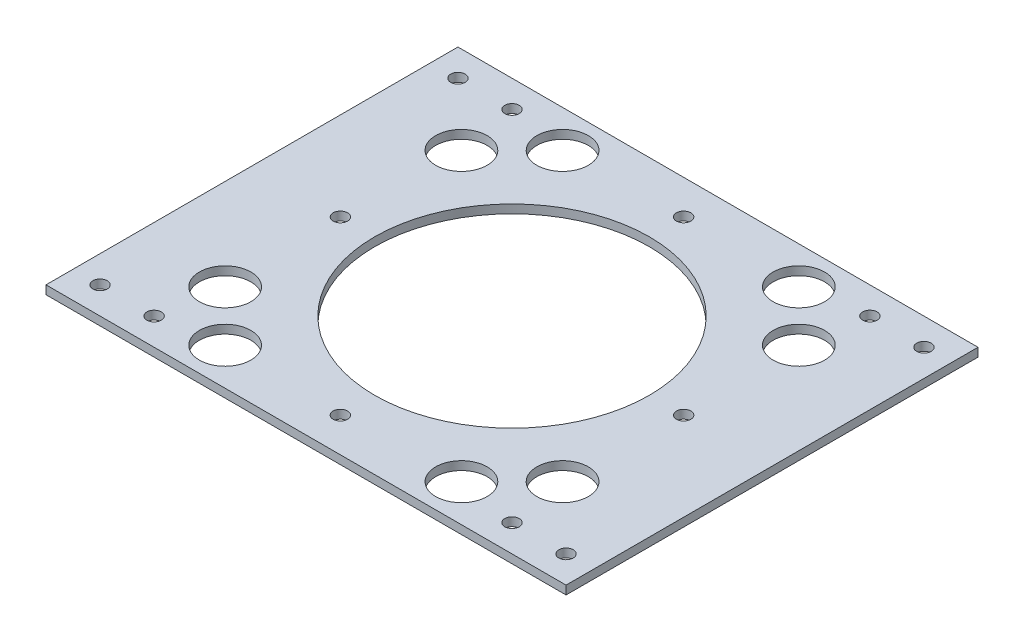
ISO-10303-21;
HEADER;
FILE_DESCRIPTION(('STEP AP214'),'2;1');
FILE_NAME('part.step','',(''),(''),'','','');
FILE_SCHEMA(('AUTOMOTIVE_DESIGN { 1 0 10303 214 1 1 1 1 }'));
ENDSEC;
DATA;
#1=APPLICATION_CONTEXT('core data for automotive mechanical design processes');
#2=APPLICATION_PROTOCOL_DEFINITION('international standard','automotive_design',2000,#1);
#3=PRODUCT_CONTEXT('',#1,'mechanical');
#4=PRODUCT('Part','Part','',(#3));
#5=PRODUCT_RELATED_PRODUCT_CATEGORY('part','',(#4));
#6=PRODUCT_DEFINITION_FORMATION('','',#4);
#7=PRODUCT_DEFINITION_CONTEXT('part definition',#1,'design');
#8=PRODUCT_DEFINITION('design','',#6,#7);
#9=PRODUCT_DEFINITION_SHAPE('','',#8);
#10=(LENGTH_UNIT() NAMED_UNIT(*) SI_UNIT(.MILLI.,.METRE.));
#11=(NAMED_UNIT(*) PLANE_ANGLE_UNIT() SI_UNIT($,.RADIAN.));
#12=(NAMED_UNIT(*) SI_UNIT($,.STERADIAN.) SOLID_ANGLE_UNIT());
#13=UNCERTAINTY_MEASURE_WITH_UNIT(LENGTH_MEASURE(1.E-05),#10,'distance_accuracy_value','');
#14=(GEOMETRIC_REPRESENTATION_CONTEXT(3) GLOBAL_UNCERTAINTY_ASSIGNED_CONTEXT((#13)) GLOBAL_UNIT_ASSIGNED_CONTEXT((#10,
#11,#12)) REPRESENTATION_CONTEXT('',''));
#15=CARTESIAN_POINT('',(0.,0.,0.));
#16=DIRECTION('',(0.,0.,1.));
#17=DIRECTION('',(1.,0.,0.));
#18=AXIS2_PLACEMENT_3D('',#15,#16,#17);
#19=CARTESIAN_POINT('',(0.,3.175,0.));
#20=DIRECTION('',(0.,-1.,0.));
#21=DIRECTION('',(0.,0.,-1.));
#22=AXIS2_PLACEMENT_3D('',#19,#20,#21);
#23=PLANE('',#22);
#24=CARTESIAN_POINT('',(-86.2,3.175,66.2));
#25=DIRECTION('',(0.,-1.,0.));
#26=DIRECTION('',(0.,0.,1.));
#27=AXIS2_PLACEMENT_3D('',#24,#25,#26);
#28=CIRCLE('',#27,2.665000004);
#29=CARTESIAN_POINT('',(-86.2,3.175,68.865000004));
#30=VERTEX_POINT('',#29);
#31=EDGE_CURVE('E398',#30,#30,#28,.T.);
#32=ORIENTED_EDGE('',*,*,#31,.T.);
#33=EDGE_LOOP('',(#32));
#34=FACE_BOUND('',#33,.T.);
#35=CARTESIAN_POINT('',(-86.2,3.175,-66.2));
#36=DIRECTION('',(0.,-1.,0.));
#37=DIRECTION('',(0.,0.,1.));
#38=AXIS2_PLACEMENT_3D('',#35,#36,#37);
#39=CIRCLE('',#38,2.665000004);
#40=CARTESIAN_POINT('',(-86.2,3.175,-63.534999996));
#41=VERTEX_POINT('',#40);
#42=EDGE_CURVE('E406',#41,#41,#39,.T.);
#43=ORIENTED_EDGE('',*,*,#42,.T.);
#44=EDGE_LOOP('',(#43));
#45=FACE_BOUND('',#44,.T.);
#46=CARTESIAN_POINT('',(86.2,3.175,66.2));
#47=DIRECTION('',(0.,1.,0.));
#48=DIRECTION('',(0.,0.,1.));
#49=AXIS2_PLACEMENT_3D('',#46,#47,#48);
#50=CIRCLE('',#49,2.665000004);
#51=CARTESIAN_POINT('',(86.2,3.175,68.865000004));
#52=VERTEX_POINT('',#51);
#53=EDGE_CURVE('E119',#52,#52,#50,.T.);
#54=ORIENTED_EDGE('',*,*,#53,.F.);
#55=EDGE_LOOP('',(#54));
#56=FACE_BOUND('',#55,.T.);
#57=CARTESIAN_POINT('',(86.2,3.175,-66.2));
#58=DIRECTION('',(0.,1.,0.));
#59=DIRECTION('',(0.,0.,1.));
#60=AXIS2_PLACEMENT_3D('',#57,#58,#59);
#61=CIRCLE('',#60,2.665000004);
#62=CARTESIAN_POINT('',(86.2,3.175,-63.534999996));
#63=VERTEX_POINT('',#62);
#64=EDGE_CURVE('E127',#63,#63,#61,.T.);
#65=ORIENTED_EDGE('',*,*,#64,.F.);
#66=EDGE_LOOP('',(#65));
#67=FACE_BOUND('',#66,.T.);
#68=CARTESIAN_POINT('',(0.,3.175,63.5));
#69=DIRECTION('',(0.,1.,0.));
#70=DIRECTION('',(0.,0.,1.));
#71=AXIS2_PLACEMENT_3D('',#68,#69,#70);
#72=CIRCLE('',#71,2.665000004);
#73=CARTESIAN_POINT('',(0.,3.175,66.165000004));
#74=VERTEX_POINT('',#73);
#75=EDGE_CURVE('E147',#74,#74,#72,.T.);
#76=ORIENTED_EDGE('',*,*,#75,.F.);
#77=EDGE_LOOP('',(#76));
#78=FACE_BOUND('',#77,.T.);
#79=CARTESIAN_POINT('',(-63.5,3.175,-2.13932557841953E-13));
#80=DIRECTION('',(0.,1.,0.));
#81=DIRECTION('',(0.,0.,1.));
#82=AXIS2_PLACEMENT_3D('',#79,#80,#81);
#83=CIRCLE('',#82,2.665000004);
#84=CARTESIAN_POINT('',(-63.5,3.175,2.66500000399978));
#85=VERTEX_POINT('',#84);
#86=EDGE_CURVE('E156',#85,#85,#83,.T.);
#87=ORIENTED_EDGE('',*,*,#86,.F.);
#88=EDGE_LOOP('',(#87));
#89=FACE_BOUND('',#88,.T.);
#90=CARTESIAN_POINT('',(4.35641622858492E-13,3.175,-63.5));
#91=DIRECTION('',(0.,1.,0.));
#92=DIRECTION('',(0.,0.,1.));
#93=AXIS2_PLACEMENT_3D('',#90,#91,#92);
#94=CIRCLE('',#93,2.665000004);
#95=CARTESIAN_POINT('',(4.35641622858492E-13,3.175,-60.834999996));
#96=VERTEX_POINT('',#95);
#97=EDGE_CURVE('E164',#96,#96,#94,.T.);
#98=ORIENTED_EDGE('',*,*,#97,.F.);
#99=EDGE_LOOP('',(#98));
#100=FACE_BOUND('',#99,.T.);
#101=CARTESIAN_POINT('',(63.5,3.175,6.57350687875031E-13));
#102=DIRECTION('',(0.,1.,0.));
#103=DIRECTION('',(0.,0.,1.));
#104=AXIS2_PLACEMENT_3D('',#101,#102,#103);
#105=CIRCLE('',#104,2.665000004);
#106=CARTESIAN_POINT('',(63.5,3.175,2.66500000400065));
#107=VERTEX_POINT('',#106);
#108=EDGE_CURVE('E172',#107,#107,#105,.T.);
#109=ORIENTED_EDGE('',*,*,#108,.F.);
#110=EDGE_LOOP('',(#109));
#111=FACE_BOUND('',#110,.T.);
#112=CARTESIAN_POINT('',(-43.7065244499497,3.175,-62.4193857748211));
#113=DIRECTION('',(0.,1.,0.));
#114=DIRECTION('',(0.,0.,1.));
#115=AXIS2_PLACEMENT_3D('',#112,#113,#114);
#116=CIRCLE('',#115,9.525);
#117=CARTESIAN_POINT('',(-43.7065244499497,3.175,-52.8943857748211));
#118=VERTEX_POINT('',#117);
#119=EDGE_CURVE('E210',#118,#118,#116,.T.);
#120=ORIENTED_EDGE('',*,*,#119,.F.);
#121=EDGE_LOOP('',(#120));
#122=FACE_BOUND('',#121,.T.);
#123=CARTESIAN_POINT('',(62.4193857748212,3.175,-43.7065244499496));
#124=DIRECTION('',(0.,1.,0.));
#125=DIRECTION('',(0.,0.,-1.));
#126=AXIS2_PLACEMENT_3D('',#123,#124,#125);
#127=CIRCLE('',#126,9.52500000000001);
#128=CARTESIAN_POINT('',(62.4193857748212,3.175,-53.2315244499496));
#129=VERTEX_POINT('',#128);
#130=EDGE_CURVE('E201',#129,#129,#127,.T.);
#131=ORIENTED_EDGE('',*,*,#130,.F.);
#132=EDGE_LOOP('',(#131));
#133=FACE_BOUND('',#132,.T.);
#134=CARTESIAN_POINT('',(43.7065244499497,3.175,-62.4193857748211));
#135=DIRECTION('',(0.,1.,0.));
#136=DIRECTION('',(0.,0.,-1.));
#137=AXIS2_PLACEMENT_3D('',#134,#135,#136);
#138=CIRCLE('',#137,9.525);
#139=CARTESIAN_POINT('',(43.7065244499497,3.175,-71.9443857748211));
#140=VERTEX_POINT('',#139);
#141=EDGE_CURVE('E226',#140,#140,#138,.T.);
#142=ORIENTED_EDGE('',*,*,#141,.F.);
#143=EDGE_LOOP('',(#142));
#144=FACE_BOUND('',#143,.T.);
#145=CARTESIAN_POINT('',(62.4193857748212,3.175,43.7065244499496));
#146=DIRECTION('',(0.,1.,0.));
#147=DIRECTION('',(0.,0.,1.));
#148=AXIS2_PLACEMENT_3D('',#145,#146,#147);
#149=CIRCLE('',#148,9.52500000000001);
#150=CARTESIAN_POINT('',(62.4193857748212,3.175,53.2315244499496));
#151=VERTEX_POINT('',#150);
#152=EDGE_CURVE('E217',#151,#151,#149,.T.);
#153=ORIENTED_EDGE('',*,*,#152,.F.);
#154=EDGE_LOOP('',(#153));
#155=FACE_BOUND('',#154,.T.);
#156=CARTESIAN_POINT('',(-62.4193857748213,3.175,43.7065244499496));
#157=DIRECTION('',(0.,1.,0.));
#158=DIRECTION('',(0.,0.,-1.));
#159=AXIS2_PLACEMENT_3D('',#156,#157,#158);
#160=CIRCLE('',#159,9.525);
#161=CARTESIAN_POINT('',(-62.4193857748213,3.175,34.1815244499496));
#162=VERTEX_POINT('',#161);
#163=EDGE_CURVE('E179',#162,#162,#160,.T.);
#164=ORIENTED_EDGE('',*,*,#163,.F.);
#165=EDGE_LOOP('',(#164));
#166=FACE_BOUND('',#165,.T.);
#167=CARTESIAN_POINT('',(-43.7065244499497,3.175,62.4193857748211));
#168=DIRECTION('',(0.,1.,0.));
#169=DIRECTION('',(0.,0.,-1.));
#170=AXIS2_PLACEMENT_3D('',#167,#168,#169);
#171=CIRCLE('',#170,9.525);
#172=CARTESIAN_POINT('',(-43.7065244499497,3.175,52.8943857748211));
#173=VERTEX_POINT('',#172);
#174=EDGE_CURVE('E194',#173,#173,#171,.T.);
#175=ORIENTED_EDGE('',*,*,#174,.F.);
#176=EDGE_LOOP('',(#175));
#177=FACE_BOUND('',#176,.T.);
#178=CARTESIAN_POINT('',(-62.4193857748212,3.175,-43.7065244499496));
#179=DIRECTION('',(0.,1.,0.));
#180=DIRECTION('',(0.,0.,1.));
#181=AXIS2_PLACEMENT_3D('',#178,#179,#180);
#182=CIRCLE('',#181,9.525);
#183=CARTESIAN_POINT('',(-62.4193857748212,3.175,-34.1815244499496));
#184=VERTEX_POINT('',#183);
#185=EDGE_CURVE('E186',#184,#184,#182,.T.);
#186=ORIENTED_EDGE('',*,*,#185,.F.);
#187=EDGE_LOOP('',(#186));
#188=FACE_BOUND('',#187,.T.);
#189=CARTESIAN_POINT('',(43.7065244499497,3.175,62.4193857748212));
#190=DIRECTION('',(0.,1.,0.));
#191=DIRECTION('',(0.,0.,1.));
#192=AXIS2_PLACEMENT_3D('',#189,#190,#191);
#193=CIRCLE('',#192,9.525);
#194=CARTESIAN_POINT('',(43.7065244499497,3.175,71.9443857748212));
#195=VERTEX_POINT('',#194);
#196=EDGE_CURVE('E233',#195,#195,#193,.T.);
#197=ORIENTED_EDGE('',*,*,#196,.F.);
#198=EDGE_LOOP('',(#197));
#199=FACE_BOUND('',#198,.T.);
#200=CARTESIAN_POINT('',(66.2,3.175,66.2));
#201=DIRECTION('',(0.,1.,0.));
#202=DIRECTION('',(0.,0.,-1.));
#203=AXIS2_PLACEMENT_3D('',#200,#201,#202);
#204=CIRCLE('',#203,2.665000004);
#205=CARTESIAN_POINT('',(66.2,3.175,63.534999996));
#206=VERTEX_POINT('',#205);
#207=EDGE_CURVE('E258',#206,#206,#204,.T.);
#208=ORIENTED_EDGE('',*,*,#207,.F.);
#209=EDGE_LOOP('',(#208));
#210=FACE_BOUND('',#209,.T.);
#211=CARTESIAN_POINT('',(66.2,3.175,-66.2));
#212=DIRECTION('',(0.,1.,0.));
#213=DIRECTION('',(0.,0.,1.));
#214=AXIS2_PLACEMENT_3D('',#211,#212,#213);
#215=CIRCLE('',#214,2.665000004);
#216=CARTESIAN_POINT('',(66.2,3.175,-63.534999996));
#217=VERTEX_POINT('',#216);
#218=EDGE_CURVE('E250',#217,#217,#215,.T.);
#219=ORIENTED_EDGE('',*,*,#218,.F.);
#220=EDGE_LOOP('',(#219));
#221=FACE_BOUND('',#220,.T.);
#222=CARTESIAN_POINT('',(-66.2,3.175,-66.2));
#223=DIRECTION('',(0.,1.,0.));
#224=DIRECTION('',(0.,0.,-1.));
#225=AXIS2_PLACEMENT_3D('',#222,#223,#224);
#226=CIRCLE('',#225,2.665000004);
#227=CARTESIAN_POINT('',(-66.2,3.175,-68.865000004));
#228=VERTEX_POINT('',#227);
#229=EDGE_CURVE('E241',#228,#228,#226,.T.);
#230=ORIENTED_EDGE('',*,*,#229,.F.);
#231=EDGE_LOOP('',(#230));
#232=FACE_BOUND('',#231,.T.);
#233=CARTESIAN_POINT('',(-66.2,3.175,66.2));
#234=DIRECTION('',(0.,1.,0.));
#235=DIRECTION('',(0.,0.,1.));
#236=AXIS2_PLACEMENT_3D('',#233,#234,#235);
#237=CIRCLE('',#236,2.665000004);
#238=CARTESIAN_POINT('',(-66.2,3.175,68.865000004));
#239=VERTEX_POINT('',#238);
#240=EDGE_CURVE('E265',#239,#239,#237,.T.);
#241=ORIENTED_EDGE('',*,*,#240,.F.);
#242=EDGE_LOOP('',(#241));
#243=FACE_BOUND('',#242,.T.);
#244=DIRECTION('',(1.,0.,0.));
#245=VECTOR('',#244,1.);
#246=CARTESIAN_POINT('',(-76.2,3.175,76.2));
#247=LINE('',#246,#245);
#248=CARTESIAN_POINT('',(-96.2,3.175,76.2));
#249=VERTEX_POINT('',#248);
#250=CARTESIAN_POINT('',(96.2,3.175,76.2));
#251=VERTEX_POINT('',#250);
#252=EDGE_CURVE('E11',#249,#251,#247,.T.);
#253=ORIENTED_EDGE('',*,*,#252,.T.);
#254=DIRECTION('',(0.,0.,1.));
#255=VECTOR('',#254,1.);
#256=CARTESIAN_POINT('',(96.2,3.175,-76.2));
#257=LINE('',#256,#255);
#258=CARTESIAN_POINT('',(96.2,3.175,-76.2));
#259=VERTEX_POINT('',#258);
#260=EDGE_CURVE('E143',#259,#251,#257,.T.);
#261=ORIENTED_EDGE('',*,*,#260,.F.);
#262=DIRECTION('',(-1.,0.,0.));
#263=VECTOR('',#262,1.);
#264=CARTESIAN_POINT('',(-76.2,3.175,-76.2));
#265=LINE('',#264,#263);
#266=CARTESIAN_POINT('',(-96.2,3.175,-76.2));
#267=VERTEX_POINT('',#266);
#268=EDGE_CURVE('E49',#259,#267,#265,.T.);
#269=ORIENTED_EDGE('',*,*,#268,.T.);
#270=DIRECTION('',(0.,0.,1.));
#271=VECTOR('',#270,1.);
#272=CARTESIAN_POINT('',(-96.2,3.175,-76.2));
#273=LINE('',#272,#271);
#274=EDGE_CURVE('E100',#267,#249,#273,.T.);
#275=ORIENTED_EDGE('',*,*,#274,.T.);
#276=EDGE_LOOP('',(#253,#261,#269,#275));
#277=FACE_BOUND('',#276,.T.);
#278=CARTESIAN_POINT('',(0.,3.175,0.));
#279=DIRECTION('',(0.,1.,0.));
#280=DIRECTION('',(0.,0.,1.));
#281=AXIS2_PLACEMENT_3D('',#278,#279,#280);
#282=CIRCLE('',#281,50.8);
#283=CARTESIAN_POINT('',(0.,3.175,50.8));
#284=VERTEX_POINT('',#283);
#285=EDGE_CURVE('E273',#284,#284,#282,.T.);
#286=ORIENTED_EDGE('',*,*,#285,.F.);
#287=EDGE_LOOP('',(#286));
#288=FACE_BOUND('',#287,.T.);
#289=ADVANCED_FACE('F39',(#34,#45,#56,#67,#78,#89,#100,#111,#122,#133,#144,#155,#166,#177,#188,
#199,#210,#221,#232,#243,#277,#288),#23,.F.);
#290=CARTESIAN_POINT('',(0.,0.,0.));
#291=DIRECTION('',(0.,-1.,0.));
#292=DIRECTION('',(0.,0.,-1.));
#293=AXIS2_PLACEMENT_3D('',#290,#291,#292);
#294=PLANE('',#293);
#295=CARTESIAN_POINT('',(-86.2,0.,66.2));
#296=DIRECTION('',(0.,-1.,0.));
#297=DIRECTION('',(0.,0.,-1.));
#298=AXIS2_PLACEMENT_3D('',#295,#296,#297);
#299=CIRCLE('',#298,2.665000004);
#300=CARTESIAN_POINT('',(-86.2,0.,63.534999996));
#301=VERTEX_POINT('',#300);
#302=EDGE_CURVE('E104',#301,#301,#299,.T.);
#303=ORIENTED_EDGE('',*,*,#302,.F.);
#304=EDGE_LOOP('',(#303));
#305=FACE_BOUND('',#304,.T.);
#306=CARTESIAN_POINT('',(-86.2,0.,-66.2));
#307=DIRECTION('',(0.,-1.,0.));
#308=DIRECTION('',(0.,0.,-1.));
#309=AXIS2_PLACEMENT_3D('',#306,#307,#308);
#310=CIRCLE('',#309,2.665000004);
#311=CARTESIAN_POINT('',(-86.2,0.,-68.865000004));
#312=VERTEX_POINT('',#311);
#313=EDGE_CURVE('E400',#312,#312,#310,.T.);
#314=ORIENTED_EDGE('',*,*,#313,.F.);
#315=EDGE_LOOP('',(#314));
#316=FACE_BOUND('',#315,.T.);
#317=CARTESIAN_POINT('',(86.2,0.,66.2));
#318=DIRECTION('',(0.,-1.,0.));
#319=DIRECTION('',(0.,0.,-1.));
#320=AXIS2_PLACEMENT_3D('',#317,#318,#319);
#321=CIRCLE('',#320,2.665000004);
#322=CARTESIAN_POINT('',(86.2,0.,63.534999996));
#323=VERTEX_POINT('',#322);
#324=EDGE_CURVE('E123',#323,#323,#321,.F.);
#325=ORIENTED_EDGE('',*,*,#324,.T.);
#326=EDGE_LOOP('',(#325));
#327=FACE_BOUND('',#326,.T.);
#328=CARTESIAN_POINT('',(86.2,0.,-66.2));
#329=DIRECTION('',(0.,-1.,0.));
#330=DIRECTION('',(0.,0.,-1.));
#331=AXIS2_PLACEMENT_3D('',#328,#329,#330);
#332=CIRCLE('',#331,2.665000004);
#333=CARTESIAN_POINT('',(86.2,0.,-68.865000004));
#334=VERTEX_POINT('',#333);
#335=EDGE_CURVE('E118',#334,#334,#332,.F.);
#336=ORIENTED_EDGE('',*,*,#335,.T.);
#337=EDGE_LOOP('',(#336));
#338=FACE_BOUND('',#337,.T.);
#339=CARTESIAN_POINT('',(0.,0.,63.5));
#340=DIRECTION('',(0.,-1.,0.));
#341=DIRECTION('',(0.,0.,-1.));
#342=AXIS2_PLACEMENT_3D('',#339,#340,#341);
#343=CIRCLE('',#342,2.665000004);
#344=CARTESIAN_POINT('',(0.,0.,60.834999996));
#345=VERTEX_POINT('',#344);
#346=EDGE_CURVE('E152',#345,#345,#343,.F.);
#347=ORIENTED_EDGE('',*,*,#346,.T.);
#348=EDGE_LOOP('',(#347));
#349=FACE_BOUND('',#348,.T.);
#350=CARTESIAN_POINT('',(-63.5,0.,-2.13932557841953E-13));
#351=DIRECTION('',(0.,-1.,0.));
#352=DIRECTION('',(0.,0.,-1.));
#353=AXIS2_PLACEMENT_3D('',#350,#351,#352);
#354=CIRCLE('',#353,2.665000004);
#355=CARTESIAN_POINT('',(-63.5,0.,-2.66500000400021));
#356=VERTEX_POINT('',#355);
#357=EDGE_CURVE('E160',#356,#356,#354,.F.);
#358=ORIENTED_EDGE('',*,*,#357,.T.);
#359=EDGE_LOOP('',(#358));
#360=FACE_BOUND('',#359,.T.);
#361=CARTESIAN_POINT('',(4.35641622858492E-13,0.,-63.5));
#362=DIRECTION('',(0.,-1.,0.));
#363=DIRECTION('',(0.,0.,-1.));
#364=AXIS2_PLACEMENT_3D('',#361,#362,#363);
#365=CIRCLE('',#364,2.665000004);
#366=CARTESIAN_POINT('',(4.35641622858492E-13,0.,-66.165000004));
#367=VERTEX_POINT('',#366);
#368=EDGE_CURVE('E168',#367,#367,#365,.F.);
#369=ORIENTED_EDGE('',*,*,#368,.T.);
#370=EDGE_LOOP('',(#369));
#371=FACE_BOUND('',#370,.T.);
#372=CARTESIAN_POINT('',(63.5,0.,6.57350687875031E-13));
#373=DIRECTION('',(0.,-1.,0.));
#374=DIRECTION('',(0.,0.,-1.));
#375=AXIS2_PLACEMENT_3D('',#372,#373,#374);
#376=CIRCLE('',#375,2.665000004);
#377=CARTESIAN_POINT('',(63.5,0.,-2.66500000399934));
#378=VERTEX_POINT('',#377);
#379=EDGE_CURVE('E146',#378,#378,#376,.F.);
#380=ORIENTED_EDGE('',*,*,#379,.T.);
#381=EDGE_LOOP('',(#380));
#382=FACE_BOUND('',#381,.T.);
#383=CARTESIAN_POINT('',(-43.7065244499497,0.,-62.4193857748211));
#384=DIRECTION('',(0.,-1.,0.));
#385=DIRECTION('',(0.,0.,-1.));
#386=AXIS2_PLACEMENT_3D('',#383,#384,#385);
#387=CIRCLE('',#386,9.525);
#388=CARTESIAN_POINT('',(-43.7065244499497,0.,-71.9443857748211));
#389=VERTEX_POINT('',#388);
#390=EDGE_CURVE('E189',#389,#389,#387,.F.);
#391=ORIENTED_EDGE('',*,*,#390,.T.);
#392=EDGE_LOOP('',(#391));
#393=FACE_BOUND('',#392,.T.);
#394=CARTESIAN_POINT('',(62.4193857748212,0.,-43.7065244499496));
#395=DIRECTION('',(0.,-1.,0.));
#396=DIRECTION('',(0.,0.,-1.));
#397=AXIS2_PLACEMENT_3D('',#394,#395,#396);
#398=CIRCLE('',#397,9.52500000000001);
#399=CARTESIAN_POINT('',(62.4193857748212,0.,-53.2315244499496));
#400=VERTEX_POINT('',#399);
#401=EDGE_CURVE('E206',#400,#400,#398,.F.);
#402=ORIENTED_EDGE('',*,*,#401,.T.);
#403=EDGE_LOOP('',(#402));
#404=FACE_BOUND('',#403,.T.);
#405=CARTESIAN_POINT('',(43.7065244499497,0.,-62.4193857748211));
#406=DIRECTION('',(0.,-1.,0.));
#407=DIRECTION('',(0.,0.,-1.));
#408=AXIS2_PLACEMENT_3D('',#405,#406,#407);
#409=CIRCLE('',#408,9.525);
#410=CARTESIAN_POINT('',(43.7065244499497,0.,-71.9443857748211));
#411=VERTEX_POINT('',#410);
#412=EDGE_CURVE('E205',#411,#411,#409,.F.);
#413=ORIENTED_EDGE('',*,*,#412,.T.);
#414=EDGE_LOOP('',(#413));
#415=FACE_BOUND('',#414,.T.);
#416=CARTESIAN_POINT('',(62.4193857748212,0.,43.7065244499496));
#417=DIRECTION('',(0.,-1.,0.));
#418=DIRECTION('',(0.,0.,-1.));
#419=AXIS2_PLACEMENT_3D('',#416,#417,#418);
#420=CIRCLE('',#419,9.52500000000001);
#421=CARTESIAN_POINT('',(62.4193857748212,0.,34.1815244499496));
#422=VERTEX_POINT('',#421);
#423=EDGE_CURVE('E222',#422,#422,#420,.F.);
#424=ORIENTED_EDGE('',*,*,#423,.T.);
#425=EDGE_LOOP('',(#424));
#426=FACE_BOUND('',#425,.T.);
#427=CARTESIAN_POINT('',(-62.4193857748213,0.,43.7065244499496));
#428=DIRECTION('',(0.,-1.,0.));
#429=DIRECTION('',(0.,0.,-1.));
#430=AXIS2_PLACEMENT_3D('',#427,#428,#429);
#431=CIRCLE('',#430,9.525);
#432=CARTESIAN_POINT('',(-62.4193857748213,0.,34.1815244499496));
#433=VERTEX_POINT('',#432);
#434=EDGE_CURVE('E151',#433,#433,#431,.F.);
#435=ORIENTED_EDGE('',*,*,#434,.T.);
#436=EDGE_LOOP('',(#435));
#437=FACE_BOUND('',#436,.T.);
#438=CARTESIAN_POINT('',(-43.7065244499497,0.,62.4193857748211));
#439=DIRECTION('',(0.,-1.,0.));
#440=DIRECTION('',(0.,0.,-1.));
#441=AXIS2_PLACEMENT_3D('',#438,#439,#440);
#442=CIRCLE('',#441,9.525);
#443=CARTESIAN_POINT('',(-43.7065244499497,0.,52.8943857748211));
#444=VERTEX_POINT('',#443);
#445=EDGE_CURVE('E183',#444,#444,#442,.F.);
#446=ORIENTED_EDGE('',*,*,#445,.T.);
#447=EDGE_LOOP('',(#446));
#448=FACE_BOUND('',#447,.T.);
#449=CARTESIAN_POINT('',(-62.4193857748212,0.,-43.7065244499496));
#450=DIRECTION('',(0.,-1.,0.));
#451=DIRECTION('',(0.,0.,-1.));
#452=AXIS2_PLACEMENT_3D('',#449,#450,#451);
#453=CIRCLE('',#452,9.525);
#454=CARTESIAN_POINT('',(-62.4193857748212,0.,-53.2315244499496));
#455=VERTEX_POINT('',#454);
#456=EDGE_CURVE('E190',#455,#455,#453,.F.);
#457=ORIENTED_EDGE('',*,*,#456,.T.);
#458=EDGE_LOOP('',(#457));
#459=FACE_BOUND('',#458,.T.);
#460=CARTESIAN_POINT('',(43.7065244499497,0.,62.4193857748212));
#461=DIRECTION('',(0.,-1.,0.));
#462=DIRECTION('',(0.,0.,-1.));
#463=AXIS2_PLACEMENT_3D('',#460,#461,#462);
#464=CIRCLE('',#463,9.525);
#465=CARTESIAN_POINT('',(43.7065244499497,0.,52.8943857748212));
#466=VERTEX_POINT('',#465);
#467=EDGE_CURVE('E221',#466,#466,#464,.F.);
#468=ORIENTED_EDGE('',*,*,#467,.T.);
#469=EDGE_LOOP('',(#468));
#470=FACE_BOUND('',#469,.T.);
#471=CARTESIAN_POINT('',(66.2,0.,66.2));
#472=DIRECTION('',(0.,-1.,0.));
#473=DIRECTION('',(0.,0.,-1.));
#474=AXIS2_PLACEMENT_3D('',#471,#472,#473);
#475=CIRCLE('',#474,2.665000004);
#476=CARTESIAN_POINT('',(66.2,0.,63.534999996));
#477=VERTEX_POINT('',#476);
#478=EDGE_CURVE('E237',#477,#477,#475,.F.);
#479=ORIENTED_EDGE('',*,*,#478,.T.);
#480=EDGE_LOOP('',(#479));
#481=FACE_BOUND('',#480,.T.);
#482=CARTESIAN_POINT('',(66.2,0.,-66.2));
#483=DIRECTION('',(0.,-1.,0.));
#484=DIRECTION('',(0.,0.,-1.));
#485=AXIS2_PLACEMENT_3D('',#482,#483,#484);
#486=CIRCLE('',#485,2.665000004);
#487=CARTESIAN_POINT('',(66.2,0.,-68.865000004));
#488=VERTEX_POINT('',#487);
#489=EDGE_CURVE('E254',#488,#488,#486,.F.);
#490=ORIENTED_EDGE('',*,*,#489,.T.);
#491=EDGE_LOOP('',(#490));
#492=FACE_BOUND('',#491,.T.);
#493=CARTESIAN_POINT('',(-66.2,0.,-66.2));
#494=DIRECTION('',(0.,-1.,0.));
#495=DIRECTION('',(0.,0.,-1.));
#496=AXIS2_PLACEMENT_3D('',#493,#494,#495);
#497=CIRCLE('',#496,2.665000004);
#498=CARTESIAN_POINT('',(-66.2,0.,-68.865000004));
#499=VERTEX_POINT('',#498);
#500=EDGE_CURVE('E246',#499,#499,#497,.F.);
#501=ORIENTED_EDGE('',*,*,#500,.T.);
#502=EDGE_LOOP('',(#501));
#503=FACE_BOUND('',#502,.T.);
#504=CARTESIAN_POINT('',(-66.2,0.,66.2));
#505=DIRECTION('',(0.,-1.,0.));
#506=DIRECTION('',(0.,0.,-1.));
#507=AXIS2_PLACEMENT_3D('',#504,#505,#506);
#508=CIRCLE('',#507,2.665000004);
#509=CARTESIAN_POINT('',(-66.2,0.,63.534999996));
#510=VERTEX_POINT('',#509);
#511=EDGE_CURVE('E245',#510,#510,#508,.F.);
#512=ORIENTED_EDGE('',*,*,#511,.T.);
#513=EDGE_LOOP('',(#512));
#514=FACE_BOUND('',#513,.T.);
#515=DIRECTION('',(-1.,0.,0.));
#516=VECTOR('',#515,1.);
#517=CARTESIAN_POINT('',(-76.2,0.,-76.2));
#518=LINE('',#517,#516);
#519=CARTESIAN_POINT('',(96.2,0.,-76.2));
#520=VERTEX_POINT('',#519);
#521=CARTESIAN_POINT('',(-96.2,0.,-76.2));
#522=VERTEX_POINT('',#521);
#523=EDGE_CURVE('E277',#520,#522,#518,.T.);
#524=ORIENTED_EDGE('',*,*,#523,.F.);
#525=DIRECTION('',(0.,0.,-1.));
#526=VECTOR('',#525,1.);
#527=CARTESIAN_POINT('',(96.2,0.,76.2));
#528=LINE('',#527,#526);
#529=CARTESIAN_POINT('',(96.2,0.,76.2));
#530=VERTEX_POINT('',#529);
#531=EDGE_CURVE('E136',#530,#520,#528,.T.);
#532=ORIENTED_EDGE('',*,*,#531,.F.);
#533=DIRECTION('',(1.,0.,0.));
#534=VECTOR('',#533,1.);
#535=CARTESIAN_POINT('',(-76.2,0.,76.2));
#536=LINE('',#535,#534);
#537=CARTESIAN_POINT('',(-96.2,0.,76.2));
#538=VERTEX_POINT('',#537);
#539=EDGE_CURVE('E43',#538,#530,#536,.T.);
#540=ORIENTED_EDGE('',*,*,#539,.F.);
#541=DIRECTION('',(0.,0.,-1.));
#542=VECTOR('',#541,1.);
#543=CARTESIAN_POINT('',(-96.2,0.,76.2));
#544=LINE('',#543,#542);
#545=EDGE_CURVE('E102',#538,#522,#544,.T.);
#546=ORIENTED_EDGE('',*,*,#545,.T.);
#547=EDGE_LOOP('',(#524,#532,#540,#546));
#548=FACE_BOUND('',#547,.T.);
#549=CARTESIAN_POINT('',(0.,0.,0.));
#550=DIRECTION('',(0.,1.,0.));
#551=DIRECTION('',(0.,0.,1.));
#552=AXIS2_PLACEMENT_3D('',#549,#550,#551);
#553=CIRCLE('',#552,50.8);
#554=CARTESIAN_POINT('',(0.,0.,50.8));
#555=VERTEX_POINT('',#554);
#556=EDGE_CURVE('E269',#555,#555,#553,.T.);
#557=ORIENTED_EDGE('',*,*,#556,.T.);
#558=EDGE_LOOP('',(#557));
#559=FACE_BOUND('',#558,.T.);
#560=ADVANCED_FACE('F286',(#305,#316,#327,#338,#349,#360,#371,#382,#393,#404,#415,#426,#437,
#448,#459,#470,#481,#492,#503,#514,#548,#559),#294,.T.);
#561=CARTESIAN_POINT('',(-76.2,3.175,-76.2));
#562=DIRECTION('',(0.,0.,1.));
#563=DIRECTION('',(1.,0.,0.));
#564=AXIS2_PLACEMENT_3D('',#561,#562,#563);
#565=PLANE('',#564);
#566=ORIENTED_EDGE('',*,*,#523,.T.);
#567=DIRECTION('',(0.,1.,0.));
#568=VECTOR('',#567,1.);
#569=CARTESIAN_POINT('',(-96.2,0.,-76.2));
#570=LINE('',#569,#568);
#571=EDGE_CURVE('E108',#522,#267,#570,.T.);
#572=ORIENTED_EDGE('',*,*,#571,.T.);
#573=ORIENTED_EDGE('',*,*,#268,.F.);
#574=DIRECTION('',(0.,1.,0.));
#575=VECTOR('',#574,1.);
#576=CARTESIAN_POINT('',(96.2,0.,-76.2));
#577=LINE('',#576,#575);
#578=EDGE_CURVE('E140',#520,#259,#577,.T.);
#579=ORIENTED_EDGE('',*,*,#578,.F.);
#580=EDGE_LOOP('',(#566,#572,#573,#579));
#581=FACE_BOUND('',#580,.T.);
#582=ADVANCED_FACE('F41',(#581),#565,.F.);
#583=CARTESIAN_POINT('',(-76.2,3.175,76.2));
#584=DIRECTION('',(0.,0.,-1.));
#585=DIRECTION('',(-1.,0.,0.));
#586=AXIS2_PLACEMENT_3D('',#583,#584,#585);
#587=PLANE('',#586);
#588=ORIENTED_EDGE('',*,*,#539,.T.);
#589=DIRECTION('',(0.,-1.,0.));
#590=VECTOR('',#589,1.);
#591=CARTESIAN_POINT('',(96.2,3.175,76.2));
#592=LINE('',#591,#590);
#593=EDGE_CURVE('E95',#251,#530,#592,.T.);
#594=ORIENTED_EDGE('',*,*,#593,.F.);
#595=ORIENTED_EDGE('',*,*,#252,.F.);
#596=DIRECTION('',(0.,-1.,0.));
#597=VECTOR('',#596,1.);
#598=CARTESIAN_POINT('',(-96.2,3.175,76.2));
#599=LINE('',#598,#597);
#600=EDGE_CURVE('E92',#249,#538,#599,.T.);
#601=ORIENTED_EDGE('',*,*,#600,.T.);
#602=EDGE_LOOP('',(#588,#594,#595,#601));
#603=FACE_BOUND('',#602,.T.);
#604=ADVANCED_FACE('F91',(#603),#587,.F.);
#605=CARTESIAN_POINT('',(0.,3.175,0.));
#606=DIRECTION('',(0.,-1.,0.));
#607=DIRECTION('',(0.,0.,-1.));
#608=AXIS2_PLACEMENT_3D('',#605,#606,#607);
#609=CYLINDRICAL_SURFACE('',#608,50.8);
#610=ORIENTED_EDGE('',*,*,#285,.T.);
#611=EDGE_LOOP('',(#610));
#612=FACE_BOUND('',#611,.T.);
#613=ORIENTED_EDGE('',*,*,#556,.F.);
#614=EDGE_LOOP('',(#613));
#615=FACE_BOUND('',#614,.T.);
#616=ADVANCED_FACE('F295',(#612,#615),#609,.F.);
#617=CARTESIAN_POINT('',(-66.2,-0.00100000000000013,66.2));
#618=DIRECTION('',(0.,1.,0.));
#619=DIRECTION('',(0.,0.,1.));
#620=AXIS2_PLACEMENT_3D('',#617,#618,#619);
#621=CYLINDRICAL_SURFACE('',#620,2.665000004);
#622=ORIENTED_EDGE('',*,*,#511,.F.);
#623=EDGE_LOOP('',(#622));
#624=FACE_BOUND('',#623,.T.);
#625=ORIENTED_EDGE('',*,*,#240,.T.);
#626=EDGE_LOOP('',(#625));
#627=FACE_BOUND('',#626,.T.);
#628=ADVANCED_FACE('F309',(#624,#627),#621,.F.);
#629=CARTESIAN_POINT('',(-66.2,-0.00100000000000013,-66.2));
#630=DIRECTION('',(0.,1.,0.));
#631=DIRECTION('',(0.,0.,1.));
#632=AXIS2_PLACEMENT_3D('',#629,#630,#631);
#633=CYLINDRICAL_SURFACE('',#632,2.665000004);
#634=ORIENTED_EDGE('',*,*,#500,.F.);
#635=EDGE_LOOP('',(#634));
#636=FACE_BOUND('',#635,.T.);
#637=ORIENTED_EDGE('',*,*,#229,.T.);
#638=EDGE_LOOP('',(#637));
#639=FACE_BOUND('',#638,.T.);
#640=ADVANCED_FACE('F313',(#636,#639),#633,.F.);
#641=CARTESIAN_POINT('',(66.2,-0.00100000000000013,-66.2));
#642=DIRECTION('',(0.,1.,0.));
#643=DIRECTION('',(0.,0.,1.));
#644=AXIS2_PLACEMENT_3D('',#641,#642,#643);
#645=CYLINDRICAL_SURFACE('',#644,2.665000004);
#646=ORIENTED_EDGE('',*,*,#489,.F.);
#647=EDGE_LOOP('',(#646));
#648=FACE_BOUND('',#647,.T.);
#649=ORIENTED_EDGE('',*,*,#218,.T.);
#650=EDGE_LOOP('',(#649));
#651=FACE_BOUND('',#650,.T.);
#652=ADVANCED_FACE('F319',(#648,#651),#645,.F.);
#653=CARTESIAN_POINT('',(66.2,-0.00100000000000013,66.2));
#654=DIRECTION('',(0.,1.,0.));
#655=DIRECTION('',(0.,0.,1.));
#656=AXIS2_PLACEMENT_3D('',#653,#654,#655);
#657=CYLINDRICAL_SURFACE('',#656,2.665000004);
#658=ORIENTED_EDGE('',*,*,#478,.F.);
#659=EDGE_LOOP('',(#658));
#660=FACE_BOUND('',#659,.T.);
#661=ORIENTED_EDGE('',*,*,#207,.T.);
#662=EDGE_LOOP('',(#661));
#663=FACE_BOUND('',#662,.T.);
#664=ADVANCED_FACE('F315',(#660,#663),#657,.F.);
#665=CARTESIAN_POINT('',(43.7065244499497,-0.00100000000000013,62.4193857748212));
#666=DIRECTION('',(0.,1.,0.));
#667=DIRECTION('',(0.,0.,1.));
#668=AXIS2_PLACEMENT_3D('',#665,#666,#667);
#669=CYLINDRICAL_SURFACE('',#668,9.525);
#670=ORIENTED_EDGE('',*,*,#467,.F.);
#671=EDGE_LOOP('',(#670));
#672=FACE_BOUND('',#671,.T.);
#673=ORIENTED_EDGE('',*,*,#196,.T.);
#674=EDGE_LOOP('',(#673));
#675=FACE_BOUND('',#674,.T.);
#676=ADVANCED_FACE('F318',(#672,#675),#669,.F.);
#677=CARTESIAN_POINT('',(-62.4193857748212,-0.00100000000000013,-43.7065244499496));
#678=DIRECTION('',(0.,1.,0.));
#679=DIRECTION('',(0.,0.,1.));
#680=AXIS2_PLACEMENT_3D('',#677,#678,#679);
#681=CYLINDRICAL_SURFACE('',#680,9.525);
#682=ORIENTED_EDGE('',*,*,#456,.F.);
#683=EDGE_LOOP('',(#682));
#684=FACE_BOUND('',#683,.T.);
#685=ORIENTED_EDGE('',*,*,#185,.T.);
#686=EDGE_LOOP('',(#685));
#687=FACE_BOUND('',#686,.T.);
#688=ADVANCED_FACE('F329',(#684,#687),#681,.F.);
#689=CARTESIAN_POINT('',(-43.7065244499497,-0.00100000000000013,62.4193857748211));
#690=DIRECTION('',(0.,1.,0.));
#691=DIRECTION('',(0.,0.,1.));
#692=AXIS2_PLACEMENT_3D('',#689,#690,#691);
#693=CYLINDRICAL_SURFACE('',#692,9.525);
#694=ORIENTED_EDGE('',*,*,#445,.F.);
#695=EDGE_LOOP('',(#694));
#696=FACE_BOUND('',#695,.T.);
#697=ORIENTED_EDGE('',*,*,#174,.T.);
#698=EDGE_LOOP('',(#697));
#699=FACE_BOUND('',#698,.T.);
#700=ADVANCED_FACE('F349',(#696,#699),#693,.F.);
#701=CARTESIAN_POINT('',(-62.4193857748213,-0.00100000000000013,43.7065244499496));
#702=DIRECTION('',(0.,1.,0.));
#703=DIRECTION('',(0.,0.,1.));
#704=AXIS2_PLACEMENT_3D('',#701,#702,#703);
#705=CYLINDRICAL_SURFACE('',#704,9.525);
#706=ORIENTED_EDGE('',*,*,#434,.F.);
#707=EDGE_LOOP('',(#706));
#708=FACE_BOUND('',#707,.T.);
#709=ORIENTED_EDGE('',*,*,#163,.T.);
#710=EDGE_LOOP('',(#709));
#711=FACE_BOUND('',#710,.T.);
#712=ADVANCED_FACE('F339',(#708,#711),#705,.F.);
#713=CARTESIAN_POINT('',(62.4193857748212,-0.00100000000000013,43.7065244499496));
#714=DIRECTION('',(0.,1.,0.));
#715=DIRECTION('',(0.,0.,1.));
#716=AXIS2_PLACEMENT_3D('',#713,#714,#715);
#717=CYLINDRICAL_SURFACE('',#716,9.52500000000001);
#718=ORIENTED_EDGE('',*,*,#423,.F.);
#719=EDGE_LOOP('',(#718));
#720=FACE_BOUND('',#719,.T.);
#721=ORIENTED_EDGE('',*,*,#152,.T.);
#722=EDGE_LOOP('',(#721));
#723=FACE_BOUND('',#722,.T.);
#724=ADVANCED_FACE('F335',(#720,#723),#717,.F.);
#725=CARTESIAN_POINT('',(43.7065244499497,-0.00100000000000013,-62.4193857748211));
#726=DIRECTION('',(0.,1.,0.));
#727=DIRECTION('',(0.,0.,1.));
#728=AXIS2_PLACEMENT_3D('',#725,#726,#727);
#729=CYLINDRICAL_SURFACE('',#728,9.525);
#730=ORIENTED_EDGE('',*,*,#412,.F.);
#731=EDGE_LOOP('',(#730));
#732=FACE_BOUND('',#731,.T.);
#733=ORIENTED_EDGE('',*,*,#141,.T.);
#734=EDGE_LOOP('',(#733));
#735=FACE_BOUND('',#734,.T.);
#736=ADVANCED_FACE('F331',(#732,#735),#729,.F.);
#737=CARTESIAN_POINT('',(62.4193857748212,-0.00100000000000013,-43.7065244499496));
#738=DIRECTION('',(0.,1.,0.));
#739=DIRECTION('',(0.,0.,1.));
#740=AXIS2_PLACEMENT_3D('',#737,#738,#739);
#741=CYLINDRICAL_SURFACE('',#740,9.52500000000001);
#742=ORIENTED_EDGE('',*,*,#401,.F.);
#743=EDGE_LOOP('',(#742));
#744=FACE_BOUND('',#743,.T.);
#745=ORIENTED_EDGE('',*,*,#130,.T.);
#746=EDGE_LOOP('',(#745));
#747=FACE_BOUND('',#746,.T.);
#748=ADVANCED_FACE('F334',(#744,#747),#741,.F.);
#749=CARTESIAN_POINT('',(-43.7065244499497,-0.00100000000000013,-62.4193857748211));
#750=DIRECTION('',(0.,1.,0.));
#751=DIRECTION('',(0.,0.,1.));
#752=AXIS2_PLACEMENT_3D('',#749,#750,#751);
#753=CYLINDRICAL_SURFACE('',#752,9.525);
#754=ORIENTED_EDGE('',*,*,#390,.F.);
#755=EDGE_LOOP('',(#754));
#756=FACE_BOUND('',#755,.T.);
#757=ORIENTED_EDGE('',*,*,#119,.T.);
#758=EDGE_LOOP('',(#757));
#759=FACE_BOUND('',#758,.T.);
#760=ADVANCED_FACE('F341',(#756,#759),#753,.F.);
#761=CARTESIAN_POINT('',(63.5,-0.00100000000000013,6.57350687875031E-13));
#762=DIRECTION('',(0.,1.,0.));
#763=DIRECTION('',(0.,0.,1.));
#764=AXIS2_PLACEMENT_3D('',#761,#762,#763);
#765=CYLINDRICAL_SURFACE('',#764,2.665000004);
#766=ORIENTED_EDGE('',*,*,#379,.F.);
#767=EDGE_LOOP('',(#766));
#768=FACE_BOUND('',#767,.T.);
#769=ORIENTED_EDGE('',*,*,#108,.T.);
#770=EDGE_LOOP('',(#769));
#771=FACE_BOUND('',#770,.T.);
#772=ADVANCED_FACE('F344',(#768,#771),#765,.F.);
#773=CARTESIAN_POINT('',(4.35641622858492E-13,-0.00100000000000013,-63.5));
#774=DIRECTION('',(0.,1.,0.));
#775=DIRECTION('',(0.,0.,1.));
#776=AXIS2_PLACEMENT_3D('',#773,#774,#775);
#777=CYLINDRICAL_SURFACE('',#776,2.665000004);
#778=ORIENTED_EDGE('',*,*,#368,.F.);
#779=EDGE_LOOP('',(#778));
#780=FACE_BOUND('',#779,.T.);
#781=ORIENTED_EDGE('',*,*,#97,.T.);
#782=EDGE_LOOP('',(#781));
#783=FACE_BOUND('',#782,.T.);
#784=ADVANCED_FACE('F361',(#780,#783),#777,.F.);
#785=CARTESIAN_POINT('',(-63.5,-0.00100000000000013,-2.13932557841953E-13));
#786=DIRECTION('',(0.,1.,0.));
#787=DIRECTION('',(0.,0.,1.));
#788=AXIS2_PLACEMENT_3D('',#785,#786,#787);
#789=CYLINDRICAL_SURFACE('',#788,2.665000004);
#790=ORIENTED_EDGE('',*,*,#357,.F.);
#791=EDGE_LOOP('',(#790));
#792=FACE_BOUND('',#791,.T.);
#793=ORIENTED_EDGE('',*,*,#86,.T.);
#794=EDGE_LOOP('',(#793));
#795=FACE_BOUND('',#794,.T.);
#796=ADVANCED_FACE('F365',(#792,#795),#789,.F.);
#797=CARTESIAN_POINT('',(0.,-0.00100000000000013,63.5));
#798=DIRECTION('',(0.,1.,0.));
#799=DIRECTION('',(0.,0.,1.));
#800=AXIS2_PLACEMENT_3D('',#797,#798,#799);
#801=CYLINDRICAL_SURFACE('',#800,2.665000004);
#802=ORIENTED_EDGE('',*,*,#346,.F.);
#803=EDGE_LOOP('',(#802));
#804=FACE_BOUND('',#803,.T.);
#805=ORIENTED_EDGE('',*,*,#75,.T.);
#806=EDGE_LOOP('',(#805));
#807=FACE_BOUND('',#806,.T.);
#808=ADVANCED_FACE('F369',(#804,#807),#801,.F.);
#809=CARTESIAN_POINT('',(96.2,0.,0.));
#810=DIRECTION('',(1.,0.,0.));
#811=DIRECTION('',(0.,0.,-1.));
#812=AXIS2_PLACEMENT_3D('',#809,#810,#811);
#813=PLANE('',#812);
#814=ORIENTED_EDGE('',*,*,#593,.T.);
#815=ORIENTED_EDGE('',*,*,#531,.T.);
#816=ORIENTED_EDGE('',*,*,#578,.T.);
#817=ORIENTED_EDGE('',*,*,#260,.T.);
#818=EDGE_LOOP('',(#814,#815,#816,#817));
#819=FACE_BOUND('',#818,.T.);
#820=ADVANCED_FACE('F289',(#819),#813,.T.);
#821=CARTESIAN_POINT('',(86.2,-0.00100000000000013,-66.2));
#822=DIRECTION('',(0.,1.,0.));
#823=DIRECTION('',(0.,0.,1.));
#824=AXIS2_PLACEMENT_3D('',#821,#822,#823);
#825=CYLINDRICAL_SURFACE('',#824,2.665000004);
#826=ORIENTED_EDGE('',*,*,#335,.F.);
#827=EDGE_LOOP('',(#826));
#828=FACE_BOUND('',#827,.T.);
#829=ORIENTED_EDGE('',*,*,#64,.T.);
#830=EDGE_LOOP('',(#829));
#831=FACE_BOUND('',#830,.T.);
#832=ADVANCED_FACE('F375',(#828,#831),#825,.F.);
#833=CARTESIAN_POINT('',(86.2,-0.00100000000000013,66.2));
#834=DIRECTION('',(0.,1.,0.));
#835=DIRECTION('',(0.,0.,1.));
#836=AXIS2_PLACEMENT_3D('',#833,#834,#835);
#837=CYLINDRICAL_SURFACE('',#836,2.665000004);
#838=ORIENTED_EDGE('',*,*,#324,.F.);
#839=EDGE_LOOP('',(#838));
#840=FACE_BOUND('',#839,.T.);
#841=ORIENTED_EDGE('',*,*,#53,.T.);
#842=EDGE_LOOP('',(#841));
#843=FACE_BOUND('',#842,.T.);
#844=ADVANCED_FACE('F378',(#840,#843),#837,.F.);
#845=CARTESIAN_POINT('',(-96.2,0.,0.));
#846=DIRECTION('',(-1.,0.,0.));
#847=DIRECTION('',(0.,0.,-1.));
#848=AXIS2_PLACEMENT_3D('',#845,#846,#847);
#849=PLANE('',#848);
#850=ORIENTED_EDGE('',*,*,#600,.F.);
#851=ORIENTED_EDGE('',*,*,#274,.F.);
#852=ORIENTED_EDGE('',*,*,#571,.F.);
#853=ORIENTED_EDGE('',*,*,#545,.F.);
#854=EDGE_LOOP('',(#850,#851,#852,#853));
#855=FACE_BOUND('',#854,.T.);
#856=ADVANCED_FACE('F98',(#855),#849,.T.);
#857=CARTESIAN_POINT('',(-86.2,-0.00100000000000013,-66.2));
#858=DIRECTION('',(0.,1.,0.));
#859=DIRECTION('',(0.,0.,1.));
#860=AXIS2_PLACEMENT_3D('',#857,#858,#859);
#861=CYLINDRICAL_SURFACE('',#860,2.665000004);
#862=ORIENTED_EDGE('',*,*,#313,.T.);
#863=EDGE_LOOP('',(#862));
#864=FACE_BOUND('',#863,.T.);
#865=ORIENTED_EDGE('',*,*,#42,.F.);
#866=EDGE_LOOP('',(#865));
#867=FACE_BOUND('',#866,.T.);
#868=ADVANCED_FACE('F385',(#864,#867),#861,.F.);
#869=CARTESIAN_POINT('',(-86.2,-0.00100000000000013,66.2));
#870=DIRECTION('',(0.,1.,0.));
#871=DIRECTION('',(0.,0.,1.));
#872=AXIS2_PLACEMENT_3D('',#869,#870,#871);
#873=CYLINDRICAL_SURFACE('',#872,2.665000004);
#874=ORIENTED_EDGE('',*,*,#302,.T.);
#875=EDGE_LOOP('',(#874));
#876=FACE_BOUND('',#875,.T.);
#877=ORIENTED_EDGE('',*,*,#31,.F.);
#878=EDGE_LOOP('',(#877));
#879=FACE_BOUND('',#878,.T.);
#880=ADVANCED_FACE('F388',(#876,#879),#873,.F.);
#881=CLOSED_SHELL('',(#289,#560,#582,#604,#616,#628,#640,#652,#664,#676,#688,#700,#712,#724,
#736,#748,#760,#772,#784,#796,#808,#820,#832,#844,#856,#868,#880));
#882=MANIFOLD_SOLID_BREP('B2',#881);
#883=ADVANCED_BREP_SHAPE_REPRESENTATION('',(#18,#882),#14);
#884=SHAPE_DEFINITION_REPRESENTATION(#9,#883);
ENDSEC;
END-ISO-10303-21;
